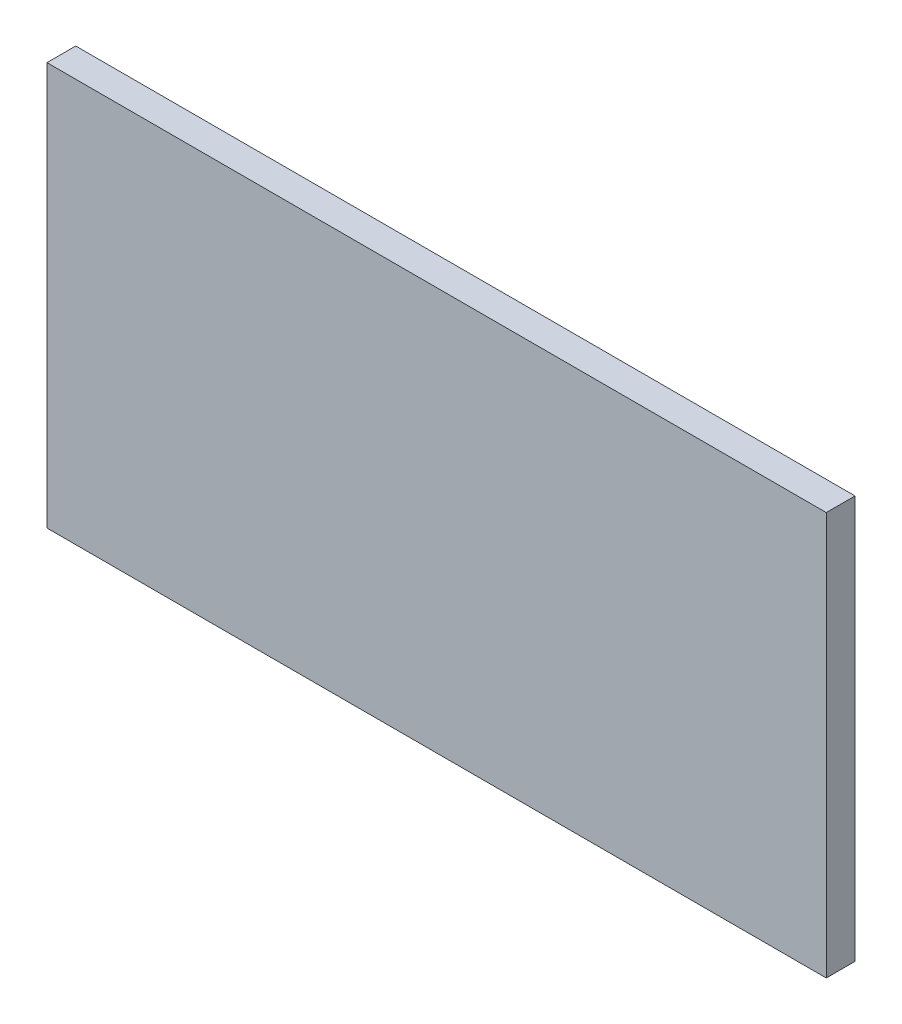
ISO-10303-21;
HEADER;
FILE_DESCRIPTION(('STEP AP214'),'2;1');
FILE_NAME('part.step','',(''),(''),'','','');
FILE_SCHEMA(('AUTOMOTIVE_DESIGN { 1 0 10303 214 1 1 1 1 }'));
ENDSEC;
DATA;
#1=APPLICATION_CONTEXT('core data for automotive mechanical design processes');
#2=APPLICATION_PROTOCOL_DEFINITION('international standard','automotive_design',2000,#1);
#3=PRODUCT_CONTEXT('',#1,'mechanical');
#4=PRODUCT('Part','Part','',(#3));
#5=PRODUCT_RELATED_PRODUCT_CATEGORY('part','',(#4));
#6=PRODUCT_DEFINITION_FORMATION('','',#4);
#7=PRODUCT_DEFINITION_CONTEXT('part definition',#1,'design');
#8=PRODUCT_DEFINITION('design','',#6,#7);
#9=PRODUCT_DEFINITION_SHAPE('','',#8);
#10=(LENGTH_UNIT() NAMED_UNIT(*) SI_UNIT(.MILLI.,.METRE.));
#11=(NAMED_UNIT(*) PLANE_ANGLE_UNIT() SI_UNIT($,.RADIAN.));
#12=(NAMED_UNIT(*) SI_UNIT($,.STERADIAN.) SOLID_ANGLE_UNIT());
#13=UNCERTAINTY_MEASURE_WITH_UNIT(LENGTH_MEASURE(1.E-05),#10,'distance_accuracy_value','');
#14=(GEOMETRIC_REPRESENTATION_CONTEXT(3) GLOBAL_UNCERTAINTY_ASSIGNED_CONTEXT((#13)) GLOBAL_UNIT_ASSIGNED_CONTEXT((#10,
#11,#12)) REPRESENTATION_CONTEXT('',''));
#15=CARTESIAN_POINT('',(0.,0.,0.));
#16=DIRECTION('',(0.,0.,1.));
#17=DIRECTION('',(1.,0.,0.));
#18=AXIS2_PLACEMENT_3D('',#15,#16,#17);
#19=CARTESIAN_POINT('',(0.,0.,0.));
#20=DIRECTION('',(0.,0.,-1.));
#21=DIRECTION('',(-1.,0.,0.));
#22=AXIS2_PLACEMENT_3D('',#19,#20,#21);
#23=PLANE('',#22);
#24=CARTESIAN_POINT('',(18.925,5.47,0.));
#25=DIRECTION('',(0.,0.,-1.));
#26=DIRECTION('',(-1.,0.,0.));
#27=AXIS2_PLACEMENT_3D('',#24,#25,#26);
#28=CIRCLE('',#27,0.650000000000001);
#29=CARTESIAN_POINT('',(18.275,5.47,0.));
#30=VERTEX_POINT('',#29);
#31=EDGE_CURVE('E230',#30,#30,#28,.T.);
#32=ORIENTED_EDGE('',*,*,#31,.F.);
#33=EDGE_LOOP('',(#32));
#34=FACE_BOUND('',#33,.T.);
#35=CARTESIAN_POINT('',(20.675,5.46999999999999,0.));
#36=DIRECTION('',(0.,0.,-1.));
#37=DIRECTION('',(-1.,0.,0.));
#38=AXIS2_PLACEMENT_3D('',#35,#36,#37);
#39=CIRCLE('',#38,0.650000000000001);
#40=CARTESIAN_POINT('',(20.025,5.46999999999999,0.));
#41=VERTEX_POINT('',#40);
#42=EDGE_CURVE('E218',#41,#41,#39,.T.);
#43=ORIENTED_EDGE('',*,*,#42,.F.);
#44=EDGE_LOOP('',(#43));
#45=FACE_BOUND('',#44,.T.);
#46=CARTESIAN_POINT('',(18.925,3.72,0.));
#47=DIRECTION('',(0.,0.,-1.));
#48=DIRECTION('',(-1.,0.,0.));
#49=AXIS2_PLACEMENT_3D('',#46,#47,#48);
#50=CIRCLE('',#49,0.650000000000001);
#51=CARTESIAN_POINT('',(18.275,3.72,0.));
#52=VERTEX_POINT('',#51);
#53=EDGE_CURVE('E206',#52,#52,#50,.T.);
#54=ORIENTED_EDGE('',*,*,#53,.F.);
#55=EDGE_LOOP('',(#54));
#56=FACE_BOUND('',#55,.T.);
#57=DIRECTION('',(0.,1.,0.));
#58=VECTOR('',#57,1.);
#59=CARTESIAN_POINT('',(0.,0.,0.));
#60=LINE('',#59,#58);
#61=CARTESIAN_POINT('',(0.,0.,0.));
#62=VERTEX_POINT('',#61);
#63=CARTESIAN_POINT('',(0.,21.,0.));
#64=VERTEX_POINT('',#63);
#65=EDGE_CURVE('E117',#62,#64,#60,.T.);
#66=ORIENTED_EDGE('',*,*,#65,.T.);
#67=DIRECTION('',(1.,0.,0.));
#68=VECTOR('',#67,1.);
#69=CARTESIAN_POINT('',(0.,21.,0.));
#70=LINE('',#69,#68);
#71=CARTESIAN_POINT('',(40.6,21.,0.));
#72=VERTEX_POINT('',#71);
#73=EDGE_CURVE('E156',#64,#72,#70,.T.);
#74=ORIENTED_EDGE('',*,*,#73,.T.);
#75=DIRECTION('',(0.,1.,0.));
#76=VECTOR('',#75,1.);
#77=CARTESIAN_POINT('',(40.6,0.,0.));
#78=LINE('',#77,#76);
#79=CARTESIAN_POINT('',(40.6,0.,0.));
#80=VERTEX_POINT('',#79);
#81=EDGE_CURVE('E159',#80,#72,#78,.T.);
#82=ORIENTED_EDGE('',*,*,#81,.F.);
#83=DIRECTION('',(1.,0.,0.));
#84=VECTOR('',#83,1.);
#85=CARTESIAN_POINT('',(0.,0.,0.));
#86=LINE('',#85,#84);
#87=EDGE_CURVE('E146',#62,#80,#86,.T.);
#88=ORIENTED_EDGE('',*,*,#87,.F.);
#89=EDGE_LOOP('',(#66,#74,#82,#88));
#90=FACE_BOUND('',#89,.T.);
#91=DIRECTION('',(1.,0.,0.));
#92=VECTOR('',#91,1.);
#93=CARTESIAN_POINT('',(6.4,15.4,0.));
#94=LINE('',#93,#92);
#95=CARTESIAN_POINT('',(6.4,15.4,0.));
#96=VERTEX_POINT('',#95);
#97=CARTESIAN_POINT('',(10.16,15.4,0.));
#98=VERTEX_POINT('',#97);
#99=EDGE_CURVE('E115',#96,#98,#94,.T.);
#100=ORIENTED_EDGE('',*,*,#99,.F.);
#101=DIRECTION('',(0.,1.,0.));
#102=VECTOR('',#101,1.);
#103=CARTESIAN_POINT('',(6.4,12.4,0.));
#104=LINE('',#103,#102);
#105=CARTESIAN_POINT('',(6.4,12.4,0.));
#106=VERTEX_POINT('',#105);
#107=EDGE_CURVE('E121',#106,#96,#104,.T.);
#108=ORIENTED_EDGE('',*,*,#107,.F.);
#109=DIRECTION('',(-1.,0.,0.));
#110=VECTOR('',#109,1.);
#111=CARTESIAN_POINT('',(6.4,12.4,0.));
#112=LINE('',#111,#110);
#113=CARTESIAN_POINT('',(10.16,12.4,0.));
#114=VERTEX_POINT('',#113);
#115=EDGE_CURVE('E133',#114,#106,#112,.T.);
#116=ORIENTED_EDGE('',*,*,#115,.F.);
#117=DIRECTION('',(0.,-1.,0.));
#118=VECTOR('',#117,1.);
#119=CARTESIAN_POINT('',(10.16,12.4,0.));
#120=LINE('',#119,#118);
#121=EDGE_CURVE('E131',#98,#114,#120,.T.);
#122=ORIENTED_EDGE('',*,*,#121,.F.);
#123=EDGE_LOOP('',(#100,#108,#116,#122));
#124=FACE_BOUND('',#123,.T.);
#125=CARTESIAN_POINT('',(20.675,3.71999999999999,0.));
#126=DIRECTION('',(0.,0.,-1.));
#127=DIRECTION('',(-1.,0.,0.));
#128=AXIS2_PLACEMENT_3D('',#125,#126,#127);
#129=CIRCLE('',#128,0.650000000000001);
#130=CARTESIAN_POINT('',(20.025,3.71999999999999,0.));
#131=VERTEX_POINT('',#130);
#132=EDGE_CURVE('E212',#131,#131,#129,.T.);
#133=ORIENTED_EDGE('',*,*,#132,.F.);
#134=EDGE_LOOP('',(#133));
#135=FACE_BOUND('',#134,.T.);
#136=CARTESIAN_POINT('',(20.675,7.21999999999999,0.));
#137=DIRECTION('',(0.,0.,-1.));
#138=DIRECTION('',(-1.,0.,0.));
#139=AXIS2_PLACEMENT_3D('',#136,#137,#138);
#140=CIRCLE('',#139,0.650000000000001);
#141=CARTESIAN_POINT('',(20.025,7.21999999999999,0.));
#142=VERTEX_POINT('',#141);
#143=EDGE_CURVE('E224',#142,#142,#140,.T.);
#144=ORIENTED_EDGE('',*,*,#143,.F.);
#145=EDGE_LOOP('',(#144));
#146=FACE_BOUND('',#145,.T.);
#147=CARTESIAN_POINT('',(18.925,7.22,0.));
#148=DIRECTION('',(0.,0.,-1.));
#149=DIRECTION('',(-1.,0.,0.));
#150=AXIS2_PLACEMENT_3D('',#147,#148,#149);
#151=CIRCLE('',#150,0.650000000000001);
#152=CARTESIAN_POINT('',(18.275,7.22,0.));
#153=VERTEX_POINT('',#152);
#154=EDGE_CURVE('E236',#153,#153,#151,.T.);
#155=ORIENTED_EDGE('',*,*,#154,.F.);
#156=EDGE_LOOP('',(#155));
#157=FACE_BOUND('',#156,.T.);
#158=ADVANCED_FACE('F35',(#34,#45,#56,#90,#124,#135,#146,#157),#23,.T.);
#159=CARTESIAN_POINT('',(0.,0.,1.5));
#160=DIRECTION('',(-1.,0.,0.));
#161=DIRECTION('',(0.,0.,1.));
#162=AXIS2_PLACEMENT_3D('',#159,#160,#161);
#163=PLANE('',#162);
#164=ORIENTED_EDGE('',*,*,#65,.F.);
#165=DIRECTION('',(0.,0.,-1.));
#166=VECTOR('',#165,1.);
#167=CARTESIAN_POINT('',(0.,0.,1.5));
#168=LINE('',#167,#166);
#169=CARTESIAN_POINT('',(0.,0.,1.5));
#170=VERTEX_POINT('',#169);
#171=EDGE_CURVE('E163',#170,#62,#168,.T.);
#172=ORIENTED_EDGE('',*,*,#171,.F.);
#173=DIRECTION('',(0.,1.,0.));
#174=VECTOR('',#173,1.);
#175=CARTESIAN_POINT('',(0.,0.,1.5));
#176=LINE('',#175,#174);
#177=CARTESIAN_POINT('',(0.,21.,1.5));
#178=VERTEX_POINT('',#177);
#179=EDGE_CURVE('E142',#170,#178,#176,.T.);
#180=ORIENTED_EDGE('',*,*,#179,.T.);
#181=DIRECTION('',(0.,0.,-1.));
#182=VECTOR('',#181,1.);
#183=CARTESIAN_POINT('',(0.,21.,1.5));
#184=LINE('',#183,#182);
#185=EDGE_CURVE('E153',#178,#64,#184,.T.);
#186=ORIENTED_EDGE('',*,*,#185,.T.);
#187=EDGE_LOOP('',(#164,#172,#180,#186));
#188=FACE_BOUND('',#187,.T.);
#189=ADVANCED_FACE('F252',(#188),#163,.T.);
#190=CARTESIAN_POINT('',(0.,0.,1.5));
#191=DIRECTION('',(0.,1.,0.));
#192=DIRECTION('',(0.,0.,1.));
#193=AXIS2_PLACEMENT_3D('',#190,#191,#192);
#194=PLANE('',#193);
#195=ORIENTED_EDGE('',*,*,#87,.T.);
#196=DIRECTION('',(0.,0.,-1.));
#197=VECTOR('',#196,1.);
#198=CARTESIAN_POINT('',(40.6,0.,1.5));
#199=LINE('',#198,#197);
#200=CARTESIAN_POINT('',(40.6,0.,1.5));
#201=VERTEX_POINT('',#200);
#202=EDGE_CURVE('E166',#201,#80,#199,.T.);
#203=ORIENTED_EDGE('',*,*,#202,.F.);
#204=DIRECTION('',(1.,0.,0.));
#205=VECTOR('',#204,1.);
#206=CARTESIAN_POINT('',(0.,0.,1.5));
#207=LINE('',#206,#205);
#208=EDGE_CURVE('E151',#170,#201,#207,.T.);
#209=ORIENTED_EDGE('',*,*,#208,.F.);
#210=ORIENTED_EDGE('',*,*,#171,.T.);
#211=EDGE_LOOP('',(#195,#203,#209,#210));
#212=FACE_BOUND('',#211,.T.);
#213=ADVANCED_FACE('F258',(#212),#194,.F.);
#214=CARTESIAN_POINT('',(40.6,0.,1.5));
#215=DIRECTION('',(-1.,0.,0.));
#216=DIRECTION('',(0.,0.,1.));
#217=AXIS2_PLACEMENT_3D('',#214,#215,#216);
#218=PLANE('',#217);
#219=ORIENTED_EDGE('',*,*,#81,.T.);
#220=DIRECTION('',(0.,0.,-1.));
#221=VECTOR('',#220,1.);
#222=CARTESIAN_POINT('',(40.6,21.,1.5));
#223=LINE('',#222,#221);
#224=CARTESIAN_POINT('',(40.6,21.,1.5));
#225=VERTEX_POINT('',#224);
#226=EDGE_CURVE('E169',#225,#72,#223,.T.);
#227=ORIENTED_EDGE('',*,*,#226,.F.);
#228=DIRECTION('',(0.,1.,0.));
#229=VECTOR('',#228,1.);
#230=CARTESIAN_POINT('',(40.6,0.,1.5));
#231=LINE('',#230,#229);
#232=EDGE_CURVE('E149',#201,#225,#231,.T.);
#233=ORIENTED_EDGE('',*,*,#232,.F.);
#234=ORIENTED_EDGE('',*,*,#202,.T.);
#235=EDGE_LOOP('',(#219,#227,#233,#234));
#236=FACE_BOUND('',#235,.T.);
#237=ADVANCED_FACE('F269',(#236),#218,.F.);
#238=CARTESIAN_POINT('',(0.,21.,1.5));
#239=DIRECTION('',(0.,1.,0.));
#240=DIRECTION('',(0.,0.,1.));
#241=AXIS2_PLACEMENT_3D('',#238,#239,#240);
#242=PLANE('',#241);
#243=ORIENTED_EDGE('',*,*,#73,.F.);
#244=ORIENTED_EDGE('',*,*,#185,.F.);
#245=DIRECTION('',(1.,0.,0.));
#246=VECTOR('',#245,1.);
#247=CARTESIAN_POINT('',(0.,21.,1.5));
#248=LINE('',#247,#246);
#249=EDGE_CURVE('E145',#178,#225,#248,.T.);
#250=ORIENTED_EDGE('',*,*,#249,.T.);
#251=ORIENTED_EDGE('',*,*,#226,.T.);
#252=EDGE_LOOP('',(#243,#244,#250,#251));
#253=FACE_BOUND('',#252,.T.);
#254=ADVANCED_FACE('F273',(#253),#242,.T.);
#255=CARTESIAN_POINT('',(0.,0.,1.5));
#256=DIRECTION('',(0.,0.,-1.));
#257=DIRECTION('',(-1.,0.,0.));
#258=AXIS2_PLACEMENT_3D('',#255,#256,#257);
#259=PLANE('',#258);
#260=ORIENTED_EDGE('',*,*,#179,.F.);
#261=ORIENTED_EDGE('',*,*,#208,.T.);
#262=ORIENTED_EDGE('',*,*,#232,.T.);
#263=ORIENTED_EDGE('',*,*,#249,.F.);
#264=EDGE_LOOP('',(#260,#261,#262,#263));
#265=FACE_BOUND('',#264,.T.);
#266=ADVANCED_FACE('F265',(#265),#259,.F.);
#267=CARTESIAN_POINT('',(6.4,12.4,-1.1));
#268=DIRECTION('',(1.,0.,0.));
#269=DIRECTION('',(0.,0.,-1.));
#270=AXIS2_PLACEMENT_3D('',#267,#268,#269);
#271=PLANE('',#270);
#272=DIRECTION('',(0.,0.,1.));
#273=VECTOR('',#272,1.);
#274=CARTESIAN_POINT('',(6.4,15.4,-1.1));
#275=LINE('',#274,#273);
#276=CARTESIAN_POINT('',(6.4,15.4,-0.6));
#277=VERTEX_POINT('',#276);
#278=EDGE_CURVE('E111',#277,#96,#275,.T.);
#279=ORIENTED_EDGE('',*,*,#278,.F.);
#280=DIRECTION('',(0.,1.,0.));
#281=VECTOR('',#280,1.);
#282=CARTESIAN_POINT('',(6.4,12.4,-0.6));
#283=LINE('',#282,#281);
#284=CARTESIAN_POINT('',(6.4,12.4,-0.6));
#285=VERTEX_POINT('',#284);
#286=EDGE_CURVE('E44',#277,#285,#283,.F.);
#287=ORIENTED_EDGE('',*,*,#286,.T.);
#288=DIRECTION('',(0.,0.,1.));
#289=VECTOR('',#288,1.);
#290=CARTESIAN_POINT('',(6.4,12.4,-1.1));
#291=LINE('',#290,#289);
#292=EDGE_CURVE('E123',#285,#106,#291,.T.);
#293=ORIENTED_EDGE('',*,*,#292,.T.);
#294=ORIENTED_EDGE('',*,*,#107,.T.);
#295=EDGE_LOOP('',(#279,#287,#293,#294));
#296=FACE_BOUND('',#295,.T.);
#297=ADVANCED_FACE('F122',(#296),#271,.F.);
#298=CARTESIAN_POINT('',(6.4,15.4,-1.1));
#299=DIRECTION('',(0.,-1.,0.));
#300=DIRECTION('',(0.,0.,-1.));
#301=AXIS2_PLACEMENT_3D('',#298,#299,#300);
#302=PLANE('',#301);
#303=DIRECTION('',(0.,0.,1.));
#304=VECTOR('',#303,1.);
#305=CARTESIAN_POINT('',(10.16,15.4,-1.1));
#306=LINE('',#305,#304);
#307=CARTESIAN_POINT('',(10.16,15.4,-0.6));
#308=VERTEX_POINT('',#307);
#309=EDGE_CURVE('E118',#308,#98,#306,.T.);
#310=ORIENTED_EDGE('',*,*,#309,.F.);
#311=DIRECTION('',(1.,0.,0.));
#312=VECTOR('',#311,1.);
#313=CARTESIAN_POINT('',(6.4,15.4,-0.6));
#314=LINE('',#313,#312);
#315=EDGE_CURVE('E59',#308,#277,#314,.F.);
#316=ORIENTED_EDGE('',*,*,#315,.T.);
#317=ORIENTED_EDGE('',*,*,#278,.T.);
#318=ORIENTED_EDGE('',*,*,#99,.T.);
#319=EDGE_LOOP('',(#310,#316,#317,#318));
#320=FACE_BOUND('',#319,.T.);
#321=ADVANCED_FACE('F113',(#320),#302,.F.);
#322=CARTESIAN_POINT('',(10.16,12.4,-1.1));
#323=DIRECTION('',(-1.,0.,0.));
#324=DIRECTION('',(0.,-1.,0.));
#325=AXIS2_PLACEMENT_3D('',#322,#323,#324);
#326=PLANE('',#325);
#327=DIRECTION('',(0.,0.,1.));
#328=VECTOR('',#327,1.);
#329=CARTESIAN_POINT('',(10.16,12.4,-1.1));
#330=LINE('',#329,#328);
#331=CARTESIAN_POINT('',(10.16,12.4,-0.6));
#332=VERTEX_POINT('',#331);
#333=EDGE_CURVE('E139',#332,#114,#330,.T.);
#334=ORIENTED_EDGE('',*,*,#333,.F.);
#335=DIRECTION('',(0.,-1.,0.));
#336=VECTOR('',#335,1.);
#337=CARTESIAN_POINT('',(10.16,15.4,-0.6));
#338=LINE('',#337,#336);
#339=EDGE_CURVE('E180',#332,#308,#338,.F.);
#340=ORIENTED_EDGE('',*,*,#339,.T.);
#341=ORIENTED_EDGE('',*,*,#309,.T.);
#342=ORIENTED_EDGE('',*,*,#121,.T.);
#343=EDGE_LOOP('',(#334,#340,#341,#342));
#344=FACE_BOUND('',#343,.T.);
#345=ADVANCED_FACE('F305',(#344),#326,.F.);
#346=CARTESIAN_POINT('',(6.4,12.4,-1.1));
#347=DIRECTION('',(0.,1.,0.));
#348=DIRECTION('',(-1.,0.,0.));
#349=AXIS2_PLACEMENT_3D('',#346,#347,#348);
#350=PLANE('',#349);
#351=ORIENTED_EDGE('',*,*,#292,.F.);
#352=DIRECTION('',(-1.,0.,0.));
#353=VECTOR('',#352,1.);
#354=CARTESIAN_POINT('',(10.16,12.4,-0.6));
#355=LINE('',#354,#353);
#356=EDGE_CURVE('E11',#285,#332,#355,.F.);
#357=ORIENTED_EDGE('',*,*,#356,.T.);
#358=ORIENTED_EDGE('',*,*,#333,.T.);
#359=ORIENTED_EDGE('',*,*,#115,.T.);
#360=EDGE_LOOP('',(#351,#357,#358,#359));
#361=FACE_BOUND('',#360,.T.);
#362=ADVANCED_FACE('F302',(#361),#350,.F.);
#363=CARTESIAN_POINT('',(0.,0.,-1.1));
#364=DIRECTION('',(0.,0.,-1.));
#365=DIRECTION('',(-1.,0.,0.));
#366=AXIS2_PLACEMENT_3D('',#363,#364,#365);
#367=PLANE('',#366);
#368=DIRECTION('',(1.,0.,0.));
#369=VECTOR('',#368,1.);
#370=CARTESIAN_POINT('',(10.16,14.9,-1.1));
#371=LINE('',#370,#369);
#372=CARTESIAN_POINT('',(6.9,14.9,-1.1));
#373=VERTEX_POINT('',#372);
#374=CARTESIAN_POINT('',(9.66,14.9,-1.1));
#375=VERTEX_POINT('',#374);
#376=EDGE_CURVE('E175',#373,#375,#371,.T.);
#377=ORIENTED_EDGE('',*,*,#376,.T.);
#378=DIRECTION('',(0.,-1.,0.));
#379=VECTOR('',#378,1.);
#380=CARTESIAN_POINT('',(9.66,12.4,-1.1));
#381=LINE('',#380,#379);
#382=CARTESIAN_POINT('',(9.66,12.9,-1.1));
#383=VERTEX_POINT('',#382);
#384=EDGE_CURVE('E177',#375,#383,#381,.T.);
#385=ORIENTED_EDGE('',*,*,#384,.T.);
#386=DIRECTION('',(-1.,0.,0.));
#387=VECTOR('',#386,1.);
#388=CARTESIAN_POINT('',(6.4,12.9,-1.1));
#389=LINE('',#388,#387);
#390=CARTESIAN_POINT('',(6.9,12.9,-1.1));
#391=VERTEX_POINT('',#390);
#392=EDGE_CURVE('E165',#383,#391,#389,.T.);
#393=ORIENTED_EDGE('',*,*,#392,.T.);
#394=DIRECTION('',(0.,1.,0.));
#395=VECTOR('',#394,1.);
#396=CARTESIAN_POINT('',(6.9,15.4,-1.1));
#397=LINE('',#396,#395);
#398=EDGE_CURVE('E173',#391,#373,#397,.T.);
#399=ORIENTED_EDGE('',*,*,#398,.T.);
#400=EDGE_LOOP('',(#377,#385,#393,#399));
#401=FACE_BOUND('',#400,.T.);
#402=CARTESIAN_POINT('',(8.98,13.9,-1.1));
#403=DIRECTION('',(0.,0.,-1.));
#404=DIRECTION('',(-1.,0.,0.));
#405=AXIS2_PLACEMENT_3D('',#402,#403,#404);
#406=CIRCLE('',#405,0.25);
#407=CARTESIAN_POINT('',(8.73,13.9,-1.1));
#408=VERTEX_POINT('',#407);
#409=EDGE_CURVE('E196',#408,#408,#406,.T.);
#410=ORIENTED_EDGE('',*,*,#409,.F.);
#411=EDGE_LOOP('',(#410));
#412=FACE_BOUND('',#411,.T.);
#413=ADVANCED_FACE('F309',(#401,#412),#367,.T.);
#414=CARTESIAN_POINT('',(8.98,13.9,-0.6));
#415=DIRECTION('',(0.,0.,-1.));
#416=DIRECTION('',(-1.,0.,0.));
#417=AXIS2_PLACEMENT_3D('',#414,#415,#416);
#418=CYLINDRICAL_SURFACE('',#417,0.25);
#419=CARTESIAN_POINT('',(8.98,13.9,-0.6));
#420=DIRECTION('',(0.,0.,-1.));
#421=DIRECTION('',(-1.,0.,0.));
#422=AXIS2_PLACEMENT_3D('',#419,#420,#421);
#423=CIRCLE('',#422,0.25);
#424=CARTESIAN_POINT('',(8.73,13.9,-0.6));
#425=VERTEX_POINT('',#424);
#426=EDGE_CURVE('E127',#425,#425,#423,.T.);
#427=ORIENTED_EDGE('',*,*,#426,.F.);
#428=EDGE_LOOP('',(#427));
#429=FACE_BOUND('',#428,.T.);
#430=ORIENTED_EDGE('',*,*,#409,.T.);
#431=EDGE_LOOP('',(#430));
#432=FACE_BOUND('',#431,.T.);
#433=ADVANCED_FACE('F295',(#429,#432),#418,.F.);
#434=CARTESIAN_POINT('',(8.98,13.9,-0.6));
#435=DIRECTION('',(0.,0.,-1.));
#436=DIRECTION('',(-1.,0.,0.));
#437=AXIS2_PLACEMENT_3D('',#434,#435,#436);
#438=PLANE('',#437);
#439=ORIENTED_EDGE('',*,*,#426,.T.);
#440=EDGE_LOOP('',(#439));
#441=FACE_BOUND('',#440,.T.);
#442=ADVANCED_FACE('F290',(#441),#438,.T.);
#443=CARTESIAN_POINT('',(6.9,0.,-0.6));
#444=DIRECTION('',(0.,-1.,0.));
#445=DIRECTION('',(0.,0.,-1.));
#446=AXIS2_PLACEMENT_3D('',#443,#444,#445);
#447=CYLINDRICAL_SURFACE('',#446,0.5);
#448=CARTESIAN_POINT('',(6.9,12.9,-0.6));
#449=DIRECTION('',(0.707106781186547,-0.707106781186548,0.));
#450=DIRECTION('',(0.707106781186548,0.707106781186547,0.));
#451=AXIS2_PLACEMENT_3D('',#448,#449,#450);
#452=ELLIPSE('',#451,0.707106781186547,0.5);
#453=EDGE_CURVE('E189',#285,#391,#452,.T.);
#454=ORIENTED_EDGE('',*,*,#453,.F.);
#455=ORIENTED_EDGE('',*,*,#286,.F.);
#456=CARTESIAN_POINT('',(6.9,14.9,-0.6));
#457=DIRECTION('',(-0.707106781186547,-0.707106781186547,0.));
#458=DIRECTION('',(0.707106781186547,-0.707106781186547,0.));
#459=AXIS2_PLACEMENT_3D('',#456,#457,#458);
#460=ELLIPSE('',#459,0.707106781186547,0.5);
#461=EDGE_CURVE('E39',#373,#277,#460,.F.);
#462=ORIENTED_EDGE('',*,*,#461,.F.);
#463=ORIENTED_EDGE('',*,*,#398,.F.);
#464=EDGE_LOOP('',(#454,#455,#462,#463));
#465=FACE_BOUND('',#464,.T.);
#466=ADVANCED_FACE('F37',(#465),#447,.T.);
#467=CARTESIAN_POINT('',(0.,14.9,-0.6));
#468=DIRECTION('',(-1.,0.,0.));
#469=DIRECTION('',(0.,0.,1.));
#470=AXIS2_PLACEMENT_3D('',#467,#468,#469);
#471=CYLINDRICAL_SURFACE('',#470,0.5);
#472=ORIENTED_EDGE('',*,*,#461,.T.);
#473=ORIENTED_EDGE('',*,*,#315,.F.);
#474=CARTESIAN_POINT('',(9.66,14.9,-0.6));
#475=DIRECTION('',(-0.707106781186547,0.707106781186548,0.));
#476=DIRECTION('',(-0.707106781186548,-0.707106781186547,0.));
#477=AXIS2_PLACEMENT_3D('',#474,#475,#476);
#478=ELLIPSE('',#477,0.707106781186548,0.5);
#479=EDGE_CURVE('E187',#375,#308,#478,.F.);
#480=ORIENTED_EDGE('',*,*,#479,.F.);
#481=ORIENTED_EDGE('',*,*,#376,.F.);
#482=EDGE_LOOP('',(#472,#473,#480,#481));
#483=FACE_BOUND('',#482,.T.);
#484=ADVANCED_FACE('F285',(#483),#471,.T.);
#485=CARTESIAN_POINT('',(0.,12.9,-0.6));
#486=DIRECTION('',(1.,0.,0.));
#487=DIRECTION('',(0.,1.,0.));
#488=AXIS2_PLACEMENT_3D('',#485,#486,#487);
#489=CYLINDRICAL_SURFACE('',#488,0.5);
#490=ORIENTED_EDGE('',*,*,#453,.T.);
#491=ORIENTED_EDGE('',*,*,#392,.F.);
#492=CARTESIAN_POINT('',(9.66,12.9,-0.6));
#493=DIRECTION('',(0.707106781186548,0.707106781186547,0.));
#494=DIRECTION('',(0.707106781186547,-0.707106781186548,0.));
#495=AXIS2_PLACEMENT_3D('',#492,#493,#494);
#496=ELLIPSE('',#495,0.707106781186547,0.5);
#497=EDGE_CURVE('E185',#332,#383,#496,.T.);
#498=ORIENTED_EDGE('',*,*,#497,.F.);
#499=ORIENTED_EDGE('',*,*,#356,.F.);
#500=EDGE_LOOP('',(#490,#491,#498,#499));
#501=FACE_BOUND('',#500,.T.);
#502=ADVANCED_FACE('F282',(#501),#489,.T.);
#503=CARTESIAN_POINT('',(9.65999999999999,0.,-0.6));
#504=DIRECTION('',(0.,1.,0.));
#505=DIRECTION('',(-1.,0.,0.));
#506=AXIS2_PLACEMENT_3D('',#503,#504,#505);
#507=CYLINDRICAL_SURFACE('',#506,0.5);
#508=ORIENTED_EDGE('',*,*,#479,.T.);
#509=ORIENTED_EDGE('',*,*,#339,.F.);
#510=ORIENTED_EDGE('',*,*,#497,.T.);
#511=ORIENTED_EDGE('',*,*,#384,.F.);
#512=EDGE_LOOP('',(#508,#509,#510,#511));
#513=FACE_BOUND('',#512,.T.);
#514=ADVANCED_FACE('F278',(#513),#507,.T.);
#515=CARTESIAN_POINT('',(18.925,3.72,-0.25));
#516=DIRECTION('',(0.,0.,1.));
#517=DIRECTION('',(1.,0.,0.));
#518=AXIS2_PLACEMENT_3D('',#515,#516,#517);
#519=CYLINDRICAL_SURFACE('',#518,0.650000000000001);
#520=CARTESIAN_POINT('',(18.925,3.72,-0.25));
#521=DIRECTION('',(0.,0.,-1.));
#522=DIRECTION('',(-1.,0.,0.));
#523=AXIS2_PLACEMENT_3D('',#520,#521,#522);
#524=CIRCLE('',#523,0.650000000000001);
#525=CARTESIAN_POINT('',(18.275,3.72,-0.25));
#526=VERTEX_POINT('',#525);
#527=EDGE_CURVE('E188',#526,#526,#524,.T.);
#528=ORIENTED_EDGE('',*,*,#527,.F.);
#529=EDGE_LOOP('',(#528));
#530=FACE_BOUND('',#529,.T.);
#531=ORIENTED_EDGE('',*,*,#53,.T.);
#532=EDGE_LOOP('',(#531));
#533=FACE_BOUND('',#532,.T.);
#534=ADVANCED_FACE('F281',(#530,#533),#519,.T.);
#535=CARTESIAN_POINT('',(18.925,3.72,-0.25));
#536=DIRECTION('',(0.,0.,-1.));
#537=DIRECTION('',(-1.,0.,0.));
#538=AXIS2_PLACEMENT_3D('',#535,#536,#537);
#539=PLANE('',#538);
#540=ORIENTED_EDGE('',*,*,#527,.T.);
#541=EDGE_LOOP('',(#540));
#542=FACE_BOUND('',#541,.T.);
#543=ADVANCED_FACE('F431',(#542),#539,.T.);
#544=CARTESIAN_POINT('',(20.675,3.71999999999999,-0.25));
#545=DIRECTION('',(0.,0.,1.));
#546=DIRECTION('',(1.,0.,0.));
#547=AXIS2_PLACEMENT_3D('',#544,#545,#546);
#548=CYLINDRICAL_SURFACE('',#547,0.650000000000001);
#549=CARTESIAN_POINT('',(20.675,3.71999999999999,-0.25));
#550=DIRECTION('',(0.,0.,-1.));
#551=DIRECTION('',(-1.,0.,0.));
#552=AXIS2_PLACEMENT_3D('',#549,#550,#551);
#553=CIRCLE('',#552,0.650000000000001);
#554=CARTESIAN_POINT('',(20.025,3.71999999999999,-0.25));
#555=VERTEX_POINT('',#554);
#556=EDGE_CURVE('E209',#555,#555,#553,.T.);
#557=ORIENTED_EDGE('',*,*,#556,.F.);
#558=EDGE_LOOP('',(#557));
#559=FACE_BOUND('',#558,.T.);
#560=ORIENTED_EDGE('',*,*,#132,.T.);
#561=EDGE_LOOP('',(#560));
#562=FACE_BOUND('',#561,.T.);
#563=ADVANCED_FACE('F440',(#559,#562),#548,.T.);
#564=CARTESIAN_POINT('',(20.675,3.71999999999999,-0.25));
#565=DIRECTION('',(0.,0.,-1.));
#566=DIRECTION('',(-1.,0.,0.));
#567=AXIS2_PLACEMENT_3D('',#564,#565,#566);
#568=PLANE('',#567);
#569=ORIENTED_EDGE('',*,*,#556,.T.);
#570=EDGE_LOOP('',(#569));
#571=FACE_BOUND('',#570,.T.);
#572=ADVANCED_FACE('F449',(#571),#568,.T.);
#573=CARTESIAN_POINT('',(20.675,5.46999999999999,-0.25));
#574=DIRECTION('',(0.,0.,1.));
#575=DIRECTION('',(1.,0.,0.));
#576=AXIS2_PLACEMENT_3D('',#573,#574,#575);
#577=CYLINDRICAL_SURFACE('',#576,0.650000000000001);
#578=CARTESIAN_POINT('',(20.675,5.46999999999999,-0.25));
#579=DIRECTION('',(0.,0.,-1.));
#580=DIRECTION('',(-1.,0.,0.));
#581=AXIS2_PLACEMENT_3D('',#578,#579,#580);
#582=CIRCLE('',#581,0.650000000000001);
#583=CARTESIAN_POINT('',(20.025,5.46999999999999,-0.25));
#584=VERTEX_POINT('',#583);
#585=EDGE_CURVE('E215',#584,#584,#582,.T.);
#586=ORIENTED_EDGE('',*,*,#585,.F.);
#587=EDGE_LOOP('',(#586));
#588=FACE_BOUND('',#587,.T.);
#589=ORIENTED_EDGE('',*,*,#42,.T.);
#590=EDGE_LOOP('',(#589));
#591=FACE_BOUND('',#590,.T.);
#592=ADVANCED_FACE('F458',(#588,#591),#577,.T.);
#593=CARTESIAN_POINT('',(20.675,5.46999999999999,-0.25));
#594=DIRECTION('',(0.,0.,-1.));
#595=DIRECTION('',(-1.,0.,0.));
#596=AXIS2_PLACEMENT_3D('',#593,#594,#595);
#597=PLANE('',#596);
#598=ORIENTED_EDGE('',*,*,#585,.T.);
#599=EDGE_LOOP('',(#598));
#600=FACE_BOUND('',#599,.T.);
#601=ADVANCED_FACE('F467',(#600),#597,.T.);
#602=CARTESIAN_POINT('',(20.675,7.21999999999999,-0.25));
#603=DIRECTION('',(0.,0.,1.));
#604=DIRECTION('',(1.,0.,0.));
#605=AXIS2_PLACEMENT_3D('',#602,#603,#604);
#606=CYLINDRICAL_SURFACE('',#605,0.650000000000001);
#607=CARTESIAN_POINT('',(20.675,7.21999999999999,-0.25));
#608=DIRECTION('',(0.,0.,-1.));
#609=DIRECTION('',(-1.,0.,0.));
#610=AXIS2_PLACEMENT_3D('',#607,#608,#609);
#611=CIRCLE('',#610,0.650000000000001);
#612=CARTESIAN_POINT('',(20.025,7.21999999999999,-0.25));
#613=VERTEX_POINT('',#612);
#614=EDGE_CURVE('E221',#613,#613,#611,.T.);
#615=ORIENTED_EDGE('',*,*,#614,.F.);
#616=EDGE_LOOP('',(#615));
#617=FACE_BOUND('',#616,.T.);
#618=ORIENTED_EDGE('',*,*,#143,.T.);
#619=EDGE_LOOP('',(#618));
#620=FACE_BOUND('',#619,.T.);
#621=ADVANCED_FACE('F476',(#617,#620),#606,.T.);
#622=CARTESIAN_POINT('',(20.675,7.21999999999999,-0.25));
#623=DIRECTION('',(0.,0.,-1.));
#624=DIRECTION('',(-1.,0.,0.));
#625=AXIS2_PLACEMENT_3D('',#622,#623,#624);
#626=PLANE('',#625);
#627=ORIENTED_EDGE('',*,*,#614,.T.);
#628=EDGE_LOOP('',(#627));
#629=FACE_BOUND('',#628,.T.);
#630=ADVANCED_FACE('F485',(#629),#626,.T.);
#631=CARTESIAN_POINT('',(18.925,5.47,-0.25));
#632=DIRECTION('',(0.,0.,1.));
#633=DIRECTION('',(1.,0.,0.));
#634=AXIS2_PLACEMENT_3D('',#631,#632,#633);
#635=CYLINDRICAL_SURFACE('',#634,0.650000000000001);
#636=CARTESIAN_POINT('',(18.925,5.47,-0.25));
#637=DIRECTION('',(0.,0.,-1.));
#638=DIRECTION('',(-1.,0.,0.));
#639=AXIS2_PLACEMENT_3D('',#636,#637,#638);
#640=CIRCLE('',#639,0.650000000000001);
#641=CARTESIAN_POINT('',(18.275,5.47,-0.25));
#642=VERTEX_POINT('',#641);
#643=EDGE_CURVE('E227',#642,#642,#640,.T.);
#644=ORIENTED_EDGE('',*,*,#643,.F.);
#645=EDGE_LOOP('',(#644));
#646=FACE_BOUND('',#645,.T.);
#647=ORIENTED_EDGE('',*,*,#31,.T.);
#648=EDGE_LOOP('',(#647));
#649=FACE_BOUND('',#648,.T.);
#650=ADVANCED_FACE('F494',(#646,#649),#635,.T.);
#651=CARTESIAN_POINT('',(18.925,5.47,-0.25));
#652=DIRECTION('',(0.,0.,-1.));
#653=DIRECTION('',(-1.,0.,0.));
#654=AXIS2_PLACEMENT_3D('',#651,#652,#653);
#655=PLANE('',#654);
#656=ORIENTED_EDGE('',*,*,#643,.T.);
#657=EDGE_LOOP('',(#656));
#658=FACE_BOUND('',#657,.T.);
#659=ADVANCED_FACE('F247',(#658),#655,.T.);
#660=CARTESIAN_POINT('',(18.925,7.22,-0.25));
#661=DIRECTION('',(0.,0.,1.));
#662=DIRECTION('',(1.,0.,0.));
#663=AXIS2_PLACEMENT_3D('',#660,#661,#662);
#664=CYLINDRICAL_SURFACE('',#663,0.650000000000001);
#665=CARTESIAN_POINT('',(18.925,7.22,-0.25));
#666=DIRECTION('',(0.,0.,-1.));
#667=DIRECTION('',(-1.,0.,0.));
#668=AXIS2_PLACEMENT_3D('',#665,#666,#667);
#669=CIRCLE('',#668,0.650000000000001);
#670=CARTESIAN_POINT('',(18.275,7.22,-0.25));
#671=VERTEX_POINT('',#670);
#672=EDGE_CURVE('E233',#671,#671,#669,.T.);
#673=ORIENTED_EDGE('',*,*,#672,.F.);
#674=EDGE_LOOP('',(#673));
#675=FACE_BOUND('',#674,.T.);
#676=ORIENTED_EDGE('',*,*,#154,.T.);
#677=EDGE_LOOP('',(#676));
#678=FACE_BOUND('',#677,.T.);
#679=ADVANCED_FACE('F244',(#675,#678),#664,.T.);
#680=CARTESIAN_POINT('',(18.925,7.22,-0.25));
#681=DIRECTION('',(0.,0.,-1.));
#682=DIRECTION('',(-1.,0.,0.));
#683=AXIS2_PLACEMENT_3D('',#680,#681,#682);
#684=PLANE('',#683);
#685=ORIENTED_EDGE('',*,*,#672,.T.);
#686=EDGE_LOOP('',(#685));
#687=FACE_BOUND('',#686,.T.);
#688=ADVANCED_FACE('F242',(#687),#684,.T.);
#689=CLOSED_SHELL('',(#158,#189,#213,#237,#254,#266,#297,#321,#345,#362,#413,#433,#442,#466,
#484,#502,#514,#534,#543,#563,#572,#592,#601,#621,#630,#650,#659,#679,#688));
#690=MANIFOLD_SOLID_BREP('B2',#689);
#691=ADVANCED_BREP_SHAPE_REPRESENTATION('',(#18,#690),#14);
#692=SHAPE_DEFINITION_REPRESENTATION(#9,#691);
ENDSEC;
END-ISO-10303-21;
